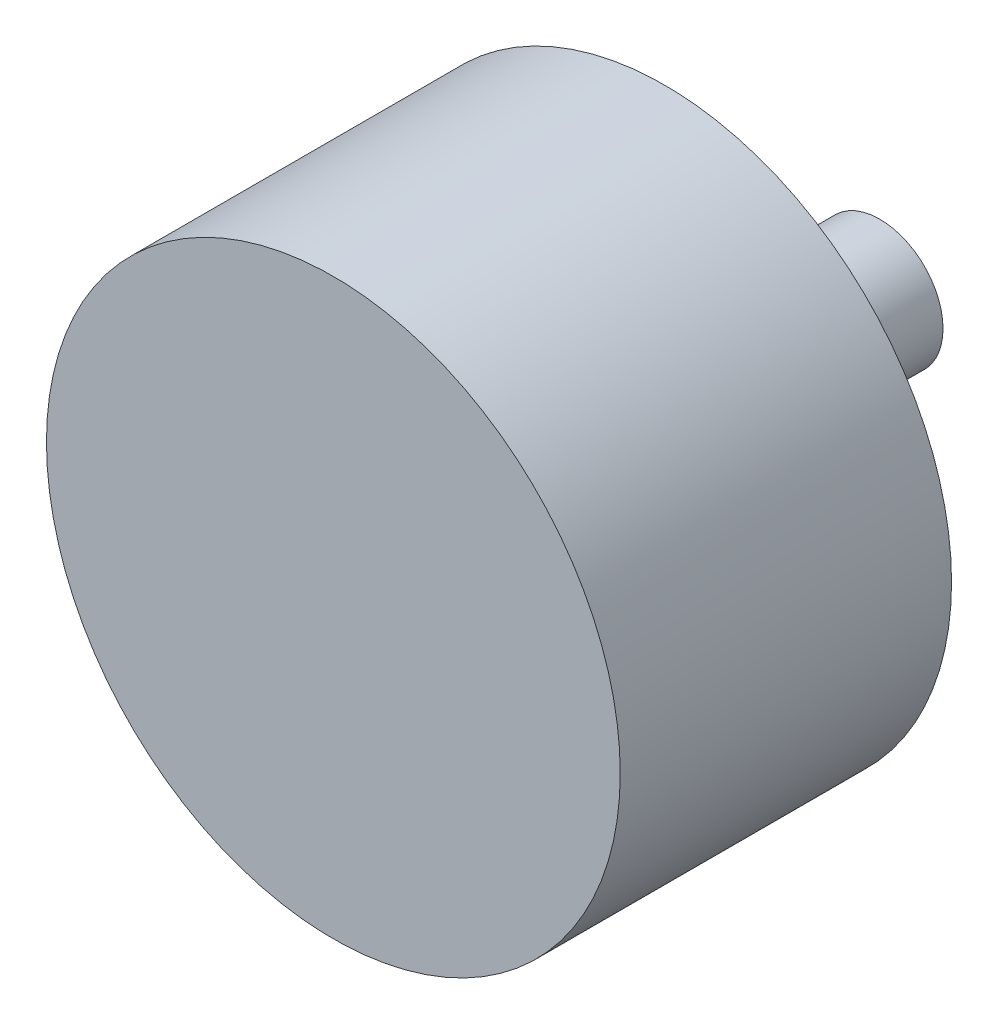
ISO-10303-21;
HEADER;
FILE_DESCRIPTION(('STEP AP214'),'2;1');
FILE_NAME('part.step','',(''),(''),'','','');
FILE_SCHEMA(('AUTOMOTIVE_DESIGN { 1 0 10303 214 1 1 1 1 }'));
ENDSEC;
DATA;
#1=APPLICATION_CONTEXT('core data for automotive mechanical design processes');
#2=APPLICATION_PROTOCOL_DEFINITION('international standard','automotive_design',2000,#1);
#3=PRODUCT_CONTEXT('',#1,'mechanical');
#4=PRODUCT('Part','Part','',(#3));
#5=PRODUCT_RELATED_PRODUCT_CATEGORY('part','',(#4));
#6=PRODUCT_DEFINITION_FORMATION('','',#4);
#7=PRODUCT_DEFINITION_CONTEXT('part definition',#1,'design');
#8=PRODUCT_DEFINITION('design','',#6,#7);
#9=PRODUCT_DEFINITION_SHAPE('','',#8);
#10=(LENGTH_UNIT() NAMED_UNIT(*) SI_UNIT(.MILLI.,.METRE.));
#11=(NAMED_UNIT(*) PLANE_ANGLE_UNIT() SI_UNIT($,.RADIAN.));
#12=(NAMED_UNIT(*) SI_UNIT($,.STERADIAN.) SOLID_ANGLE_UNIT());
#13=UNCERTAINTY_MEASURE_WITH_UNIT(LENGTH_MEASURE(1.E-05),#10,'distance_accuracy_value','');
#14=(GEOMETRIC_REPRESENTATION_CONTEXT(3) GLOBAL_UNCERTAINTY_ASSIGNED_CONTEXT((#13)) GLOBAL_UNIT_ASSIGNED_CONTEXT((#10,
#11,#12)) REPRESENTATION_CONTEXT('',''));
#15=CARTESIAN_POINT('',(0.,0.,0.));
#16=DIRECTION('',(0.,0.,1.));
#17=DIRECTION('',(1.,0.,0.));
#18=AXIS2_PLACEMENT_3D('',#15,#16,#17);
#19=CARTESIAN_POINT('',(0.,0.,0.));
#20=DIRECTION('',(0.,0.,-1.));
#21=DIRECTION('',(-1.,0.,0.));
#22=AXIS2_PLACEMENT_3D('',#19,#20,#21);
#23=PLANE('',#22);
#24=CARTESIAN_POINT('',(0.,0.,0.));
#25=DIRECTION('',(0.,0.,1.));
#26=DIRECTION('',(1.,0.,0.));
#27=AXIS2_PLACEMENT_3D('',#24,#25,#26);
#28=CIRCLE('',#27,21.336);
#29=CARTESIAN_POINT('',(21.336,0.,0.));
#30=VERTEX_POINT('',#29);
#31=EDGE_CURVE('E10',#30,#30,#28,.T.);
#32=ORIENTED_EDGE('',*,*,#31,.T.);
#33=EDGE_LOOP('',(#32));
#34=FACE_BOUND('',#33,.T.);
#35=ADVANCED_FACE('F37',(#34),#23,.F.);
#36=CARTESIAN_POINT('',(0.,0.,0.));
#37=DIRECTION('',(0.,0.,1.));
#38=DIRECTION('',(1.,0.,0.));
#39=AXIS2_PLACEMENT_3D('',#36,#37,#38);
#40=CYLINDRICAL_SURFACE('',#39,21.336);
#41=ORIENTED_EDGE('',*,*,#31,.F.);
#42=EDGE_LOOP('',(#41));
#43=FACE_BOUND('',#42,.T.);
#44=CARTESIAN_POINT('',(0.,0.,-24.638));
#45=DIRECTION('',(0.,0.,1.));
#46=DIRECTION('',(1.,0.,0.));
#47=AXIS2_PLACEMENT_3D('',#44,#45,#46);
#48=CIRCLE('',#47,21.336);
#49=CARTESIAN_POINT('',(21.336,0.,-24.638));
#50=VERTEX_POINT('',#49);
#51=EDGE_CURVE('E44',#50,#50,#48,.T.);
#52=ORIENTED_EDGE('',*,*,#51,.T.);
#53=EDGE_LOOP('',(#52));
#54=FACE_BOUND('',#53,.T.);
#55=ADVANCED_FACE('F81',(#43,#54),#40,.T.);
#56=CARTESIAN_POINT('',(0.,21.336,-24.638));
#57=DIRECTION('',(0.,0.,1.));
#58=DIRECTION('',(1.,0.,0.));
#59=AXIS2_PLACEMENT_3D('',#56,#57,#58);
#60=PLANE('',#59);
#61=ORIENTED_EDGE('',*,*,#51,.F.);
#62=EDGE_LOOP('',(#61));
#63=FACE_BOUND('',#62,.T.);
#64=CARTESIAN_POINT('',(0.,0.,-24.638));
#65=DIRECTION('',(0.,0.,1.));
#66=DIRECTION('',(1.,0.,0.));
#67=AXIS2_PLACEMENT_3D('',#64,#65,#66);
#68=CIRCLE('',#67,5.461);
#69=CARTESIAN_POINT('',(5.461,0.,-24.638));
#70=VERTEX_POINT('',#69);
#71=EDGE_CURVE('E50',#70,#70,#68,.T.);
#72=ORIENTED_EDGE('',*,*,#71,.T.);
#73=EDGE_LOOP('',(#72));
#74=FACE_BOUND('',#73,.T.);
#75=ADVANCED_FACE('F85',(#63,#74),#60,.F.);
#76=CARTESIAN_POINT('',(0.,0.,0.));
#77=DIRECTION('',(0.,0.,1.));
#78=DIRECTION('',(1.,0.,0.));
#79=AXIS2_PLACEMENT_3D('',#76,#77,#78);
#80=CYLINDRICAL_SURFACE('',#79,5.461);
#81=ORIENTED_EDGE('',*,*,#71,.F.);
#82=EDGE_LOOP('',(#81));
#83=FACE_BOUND('',#82,.T.);
#84=CARTESIAN_POINT('',(0.,0.,-30.48));
#85=DIRECTION('',(0.,0.,1.));
#86=DIRECTION('',(1.,0.,0.));
#87=AXIS2_PLACEMENT_3D('',#84,#85,#86);
#88=CIRCLE('',#87,5.461);
#89=CARTESIAN_POINT('',(5.461,0.,-30.48));
#90=VERTEX_POINT('',#89);
#91=EDGE_CURVE('E56',#90,#90,#88,.T.);
#92=ORIENTED_EDGE('',*,*,#91,.T.);
#93=EDGE_LOOP('',(#92));
#94=FACE_BOUND('',#93,.T.);
#95=ADVANCED_FACE('F90',(#83,#94),#80,.T.);
#96=CARTESIAN_POINT('',(0.,5.461,-30.48));
#97=DIRECTION('',(0.,0.,1.));
#98=DIRECTION('',(1.,0.,0.));
#99=AXIS2_PLACEMENT_3D('',#96,#97,#98);
#100=PLANE('',#99);
#101=ORIENTED_EDGE('',*,*,#91,.F.);
#102=EDGE_LOOP('',(#101));
#103=FACE_BOUND('',#102,.T.);
#104=CARTESIAN_POINT('',(0.,0.,-30.48));
#105=DIRECTION('',(0.,0.,1.));
#106=DIRECTION('',(1.,0.,0.));
#107=AXIS2_PLACEMENT_3D('',#104,#105,#106);
#108=CIRCLE('',#107,4.699);
#109=CARTESIAN_POINT('',(4.699,0.,-30.48));
#110=VERTEX_POINT('',#109);
#111=EDGE_CURVE('E61',#110,#110,#108,.T.);
#112=ORIENTED_EDGE('',*,*,#111,.T.);
#113=EDGE_LOOP('',(#112));
#114=FACE_BOUND('',#113,.T.);
#115=ADVANCED_FACE('F77',(#103,#114),#100,.F.);
#116=CARTESIAN_POINT('',(0.,0.,0.));
#117=DIRECTION('',(0.,0.,1.));
#118=DIRECTION('',(1.,0.,0.));
#119=AXIS2_PLACEMENT_3D('',#116,#117,#118);
#120=CYLINDRICAL_SURFACE('',#119,4.699);
#121=ORIENTED_EDGE('',*,*,#111,.F.);
#122=EDGE_LOOP('',(#121));
#123=FACE_BOUND('',#122,.T.);
#124=CARTESIAN_POINT('',(0.,0.,-40.64));
#125=DIRECTION('',(0.,0.,1.));
#126=DIRECTION('',(1.,0.,0.));
#127=AXIS2_PLACEMENT_3D('',#124,#125,#126);
#128=CIRCLE('',#127,4.699);
#129=CARTESIAN_POINT('',(4.699,0.,-40.64));
#130=VERTEX_POINT('',#129);
#131=EDGE_CURVE('E64',#130,#130,#128,.T.);
#132=ORIENTED_EDGE('',*,*,#131,.T.);
#133=EDGE_LOOP('',(#132));
#134=FACE_BOUND('',#133,.T.);
#135=ADVANCED_FACE('F69',(#123,#134),#120,.T.);
#136=CARTESIAN_POINT('',(0.,4.699,-40.64));
#137=DIRECTION('',(0.,0.,1.));
#138=DIRECTION('',(1.,0.,0.));
#139=AXIS2_PLACEMENT_3D('',#136,#137,#138);
#140=PLANE('',#139);
#141=ORIENTED_EDGE('',*,*,#131,.F.);
#142=EDGE_LOOP('',(#141));
#143=FACE_BOUND('',#142,.T.);
#144=ADVANCED_FACE('F71',(#143),#140,.F.);
#145=CLOSED_SHELL('',(#35,#55,#75,#95,#115,#135,#144));
#146=MANIFOLD_SOLID_BREP('B2',#145);
#147=ADVANCED_BREP_SHAPE_REPRESENTATION('',(#18,#146),#14);
#148=SHAPE_DEFINITION_REPRESENTATION(#9,#147);
ENDSEC;
END-ISO-10303-21;
